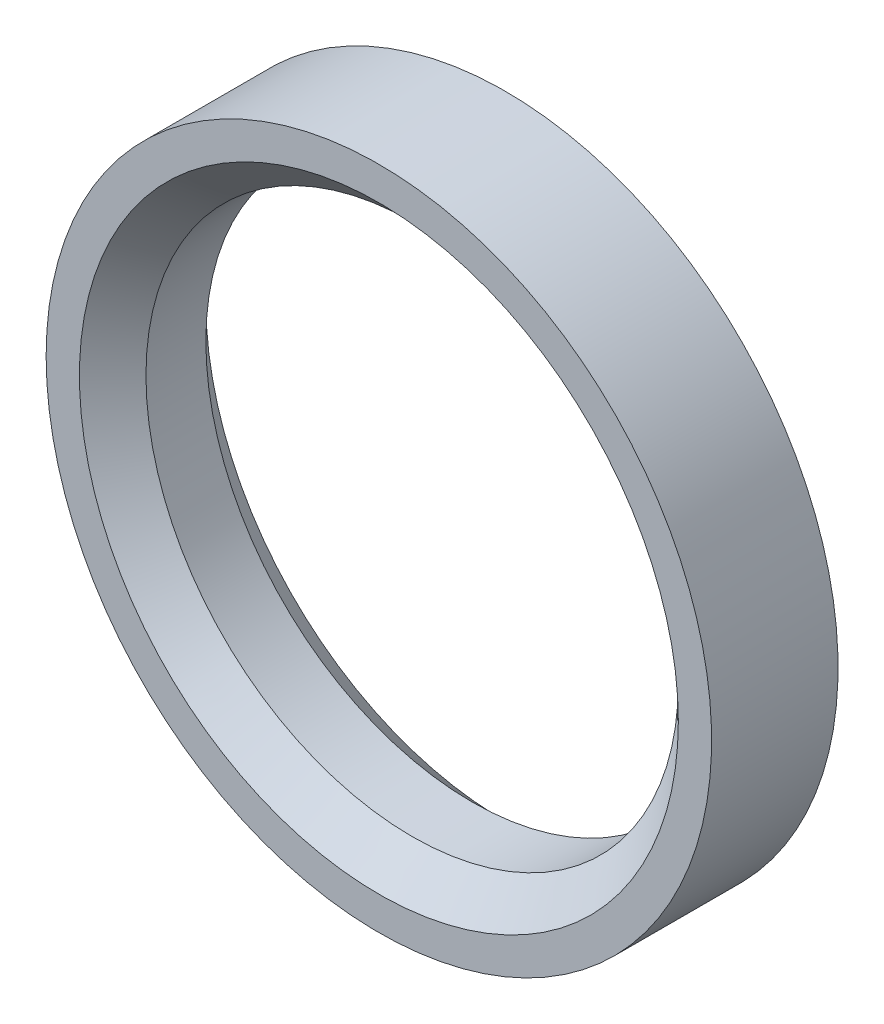
ISO-10303-21;
HEADER;
FILE_DESCRIPTION(('STEP AP214'),'2;1');
FILE_NAME('part.step','',(''),(''),'','','');
FILE_SCHEMA(('AUTOMOTIVE_DESIGN { 1 0 10303 214 1 1 1 1 }'));
ENDSEC;
DATA;
#1=APPLICATION_CONTEXT('core data for automotive mechanical design processes');
#2=APPLICATION_PROTOCOL_DEFINITION('international standard','automotive_design',2000,#1);
#3=PRODUCT_CONTEXT('',#1,'mechanical');
#4=PRODUCT('Part','Part','',(#3));
#5=PRODUCT_RELATED_PRODUCT_CATEGORY('part','',(#4));
#6=PRODUCT_DEFINITION_FORMATION('','',#4);
#7=PRODUCT_DEFINITION_CONTEXT('part definition',#1,'design');
#8=PRODUCT_DEFINITION('design','',#6,#7);
#9=PRODUCT_DEFINITION_SHAPE('','',#8);
#10=(LENGTH_UNIT() NAMED_UNIT(*) SI_UNIT(.MILLI.,.METRE.));
#11=(NAMED_UNIT(*) PLANE_ANGLE_UNIT() SI_UNIT($,.RADIAN.));
#12=(NAMED_UNIT(*) SI_UNIT($,.STERADIAN.) SOLID_ANGLE_UNIT());
#13=UNCERTAINTY_MEASURE_WITH_UNIT(LENGTH_MEASURE(1.E-05),#10,'distance_accuracy_value','');
#14=(GEOMETRIC_REPRESENTATION_CONTEXT(3) GLOBAL_UNCERTAINTY_ASSIGNED_CONTEXT((#13)) GLOBAL_UNIT_ASSIGNED_CONTEXT((#10,
#11,#12)) REPRESENTATION_CONTEXT('',''));
#15=CARTESIAN_POINT('',(0.,0.,0.));
#16=DIRECTION('',(0.,0.,1.));
#17=DIRECTION('',(1.,0.,0.));
#18=AXIS2_PLACEMENT_3D('',#15,#16,#17);
#19=CARTESIAN_POINT('',(0.,0.,1.9));
#20=DIRECTION('',(0.,0.,1.));
#21=DIRECTION('',(1.,0.,0.));
#22=AXIS2_PLACEMENT_3D('',#19,#20,#21);
#23=PLANE('',#22);
#24=CARTESIAN_POINT('',(0.,0.,1.9));
#25=DIRECTION('',(0.,0.,1.));
#26=DIRECTION('',(1.,0.,0.));
#27=AXIS2_PLACEMENT_3D('',#24,#25,#26);
#28=CIRCLE('',#27,4.50000000000001);
#29=CARTESIAN_POINT('',(4.50000000000001,0.,1.9));
#30=VERTEX_POINT('',#29);
#31=EDGE_CURVE('E10',#30,#30,#28,.F.);
#32=ORIENTED_EDGE('',*,*,#31,.T.);
#33=EDGE_LOOP('',(#32));
#34=FACE_BOUND('',#33,.T.);
#35=CARTESIAN_POINT('',(0.,0.,1.9));
#36=DIRECTION('',(0.,0.,1.));
#37=DIRECTION('',(1.,0.,0.));
#38=AXIS2_PLACEMENT_3D('',#35,#36,#37);
#39=CIRCLE('',#38,5.);
#40=CARTESIAN_POINT('',(-5.,0.,1.9));
#41=VERTEX_POINT('',#40);
#42=EDGE_CURVE('E53',#41,#41,#39,.T.);
#43=ORIENTED_EDGE('',*,*,#42,.T.);
#44=EDGE_LOOP('',(#43));
#45=FACE_BOUND('',#44,.T.);
#46=ADVANCED_FACE('F33',(#34,#45),#23,.T.);
#47=CARTESIAN_POINT('',(0.,0.,0.));
#48=DIRECTION('',(0.,0.,1.));
#49=DIRECTION('',(1.,0.,0.));
#50=AXIS2_PLACEMENT_3D('',#47,#48,#49);
#51=PLANE('',#50);
#52=CARTESIAN_POINT('',(0.,0.,0.));
#53=DIRECTION('',(0.,0.,1.));
#54=DIRECTION('',(1.,0.,0.));
#55=AXIS2_PLACEMENT_3D('',#52,#53,#54);
#56=CIRCLE('',#55,4.5);
#57=CARTESIAN_POINT('',(4.5,0.,0.));
#58=VERTEX_POINT('',#57);
#59=EDGE_CURVE('E48',#58,#58,#56,.T.);
#60=ORIENTED_EDGE('',*,*,#59,.T.);
#61=EDGE_LOOP('',(#60));
#62=FACE_BOUND('',#61,.T.);
#63=CARTESIAN_POINT('',(0.,0.,0.));
#64=DIRECTION('',(0.,0.,1.));
#65=DIRECTION('',(1.,0.,0.));
#66=AXIS2_PLACEMENT_3D('',#63,#64,#65);
#67=CIRCLE('',#66,5.);
#68=CARTESIAN_POINT('',(-5.,0.,0.));
#69=VERTEX_POINT('',#68);
#70=EDGE_CURVE('E54',#69,#69,#67,.T.);
#71=ORIENTED_EDGE('',*,*,#70,.F.);
#72=EDGE_LOOP('',(#71));
#73=FACE_BOUND('',#72,.T.);
#74=ADVANCED_FACE('F65',(#62,#73),#51,.F.);
#75=CARTESIAN_POINT('',(0.,0.,1.9));
#76=DIRECTION('',(0.,0.,-1.));
#77=DIRECTION('',(-1.,0.,0.));
#78=AXIS2_PLACEMENT_3D('',#75,#76,#77);
#79=CYLINDRICAL_SURFACE('',#78,5.);
#80=CARTESIAN_POINT('',(-5.,0.,1.9));
#81=CARTESIAN_POINT('',(-5.,0.,1.88020833333333));
#82=CARTESIAN_POINT('',(-5.,0.,1.86041666666667));
#83=CARTESIAN_POINT('',(-5.,0.,1.82083333333333));
#84=CARTESIAN_POINT('',(-5.,0.,1.80104166666667));
#85=CARTESIAN_POINT('',(-5.,0.,1.76145833333333));
#86=CARTESIAN_POINT('',(-5.,0.,1.74166666666667));
#87=CARTESIAN_POINT('',(-5.,0.,1.70208333333333));
#88=CARTESIAN_POINT('',(-5.,0.,1.68229166666667));
#89=CARTESIAN_POINT('',(-5.,0.,1.64270833333333));
#90=CARTESIAN_POINT('',(-5.,0.,1.62291666666667));
#91=CARTESIAN_POINT('',(-5.,0.,1.58333333333333));
#92=CARTESIAN_POINT('',(-5.,0.,1.56354166666667));
#93=CARTESIAN_POINT('',(-5.,0.,1.52395833333333));
#94=CARTESIAN_POINT('',(-5.,0.,1.50416666666667));
#95=CARTESIAN_POINT('',(-5.,0.,1.46458333333333));
#96=CARTESIAN_POINT('',(-5.,0.,1.44479166666667));
#97=CARTESIAN_POINT('',(-5.,0.,1.40520833333333));
#98=CARTESIAN_POINT('',(-5.,0.,1.38541666666667));
#99=CARTESIAN_POINT('',(-5.,0.,1.34583333333333));
#100=CARTESIAN_POINT('',(-5.,0.,1.32604166666667));
#101=CARTESIAN_POINT('',(-5.,0.,1.28645833333333));
#102=CARTESIAN_POINT('',(-5.,0.,1.26666666666667));
#103=CARTESIAN_POINT('',(-5.,0.,1.22708333333333));
#104=CARTESIAN_POINT('',(-5.,0.,1.20729166666667));
#105=CARTESIAN_POINT('',(-5.,0.,1.16770833333333));
#106=CARTESIAN_POINT('',(-5.,0.,1.14791666666667));
#107=CARTESIAN_POINT('',(-5.,0.,1.10833333333333));
#108=CARTESIAN_POINT('',(-5.,0.,1.08854166666667));
#109=CARTESIAN_POINT('',(-5.,0.,1.04895833333333));
#110=CARTESIAN_POINT('',(-5.,0.,1.02916666666667));
#111=CARTESIAN_POINT('',(-5.,0.,0.989583333333333));
#112=CARTESIAN_POINT('',(-5.,0.,0.969791666666666));
#113=CARTESIAN_POINT('',(-5.,0.,0.930208333333333));
#114=CARTESIAN_POINT('',(-5.,0.,0.910416666666666));
#115=CARTESIAN_POINT('',(-5.,0.,0.870833333333333));
#116=CARTESIAN_POINT('',(-5.,0.,0.851041666666666));
#117=CARTESIAN_POINT('',(-5.,0.,0.811458333333333));
#118=CARTESIAN_POINT('',(-5.,0.,0.791666666666666));
#119=CARTESIAN_POINT('',(-5.,0.,0.752083333333333));
#120=CARTESIAN_POINT('',(-5.,0.,0.732291666666666));
#121=CARTESIAN_POINT('',(-5.,0.,0.692708333333333));
#122=CARTESIAN_POINT('',(-5.,0.,0.672916666666666));
#123=CARTESIAN_POINT('',(-5.,0.,0.633333333333333));
#124=CARTESIAN_POINT('',(-5.,0.,0.613541666666666));
#125=CARTESIAN_POINT('',(-5.,0.,0.573958333333333));
#126=CARTESIAN_POINT('',(-5.,0.,0.554166666666666));
#127=CARTESIAN_POINT('',(-5.,0.,0.514583333333333));
#128=CARTESIAN_POINT('',(-5.,0.,0.494791666666666));
#129=CARTESIAN_POINT('',(-5.,0.,0.455208333333333));
#130=CARTESIAN_POINT('',(-5.,0.,0.435416666666666));
#131=CARTESIAN_POINT('',(-5.,0.,0.395833333333333));
#132=CARTESIAN_POINT('',(-5.,0.,0.376041666666666));
#133=CARTESIAN_POINT('',(-5.,0.,0.336458333333333));
#134=CARTESIAN_POINT('',(-5.,0.,0.316666666666666));
#135=CARTESIAN_POINT('',(-5.,0.,0.277083333333333));
#136=CARTESIAN_POINT('',(-5.,0.,0.257291666666666));
#137=CARTESIAN_POINT('',(-5.,0.,0.217708333333333));
#138=CARTESIAN_POINT('',(-5.,0.,0.197916666666666));
#139=CARTESIAN_POINT('',(-5.,0.,0.158333333333333));
#140=CARTESIAN_POINT('',(-5.,0.,0.138541666666666));
#141=CARTESIAN_POINT('',(-5.,0.,0.0989583333333331));
#142=CARTESIAN_POINT('',(-5.,0.,0.0791666666666664));
#143=CARTESIAN_POINT('',(-5.,0.,0.0395833333333331));
#144=CARTESIAN_POINT('',(-5.,0.,0.0197916666666664));
#145=CARTESIAN_POINT('',(-5.,0.,0.));
#146=B_SPLINE_CURVE_WITH_KNOTS('',3,(#80,#81,#82,#83,#84,#85,#86,#87,#88,#89,#90,#91,#92,#93,
#94,#95,#96,#97,#98,#99,#100,#101,#102,#103,#104,#105,#106,#107,#108,#109,#110,#111,#112,#113,
#114,#115,#116,#117,#118,#119,#120,#121,#122,#123,#124,#125,#126,#127,#128,#129,#130,#131,#132,
#133,#134,#135,#136,#137,#138,#139,#140,#141,#142,#143,#144,#145),.UNSPECIFIED.,.F.,.F.,(4,2,2,
2,2,2,2,2,2,2,2,2,2,2,2,2,2,2,2,2,2,2,2,2,2,2,2,2,2,2,2,2,4),(0.,0.0593749999999997,0.11875,
0.178125,0.2375,0.296875,0.35625,0.415625,0.475,0.534374999999999,0.593749999999999,
0.653124999999999,0.712499999999999,0.771874999999999,0.831249999999999,0.890624999999999,
0.949999999999999,1.009375,1.06875,1.128125,1.1875,1.246875,1.30625,1.365625,1.425,1.484375,
1.54375,1.603125,1.6625,1.721875,1.78125,1.840625,1.9),.UNSPECIFIED.);
#147=EDGE_CURVE('BSEAM61',#41,#69,#146,.T.);
#148=ORIENTED_EDGE('',*,*,#42,.F.);
#149=ORIENTED_EDGE('',*,*,#70,.T.);
#150=ORIENTED_EDGE('',*,*,#147,.T.);
#151=ORIENTED_EDGE('',*,*,#147,.F.);
#152=EDGE_LOOP('',(#148,#150,#149,#151));
#153=FACE_BOUND('',#152,.T.);
#154=ADVANCED_FACE('F61',(#153),#79,.T.);
#155=CARTESIAN_POINT('',(0.,0.,1.9));
#156=DIRECTION('',(0.,0.,-1.));
#157=DIRECTION('',(-1.,0.,0.));
#158=AXIS2_PLACEMENT_3D('',#155,#156,#157);
#159=CYLINDRICAL_SURFACE('',#158,4.);
#160=CARTESIAN_POINT('',(0.,0.,0.5));
#161=DIRECTION('',(0.,0.,1.));
#162=DIRECTION('',(1.,0.,0.));
#163=AXIS2_PLACEMENT_3D('',#160,#161,#162);
#164=CIRCLE('',#163,4.);
#165=CARTESIAN_POINT('',(-4.,0.,0.5));
#166=VERTEX_POINT('',#165);
#167=EDGE_CURVE('E40',#166,#166,#164,.F.);
#168=CARTESIAN_POINT('',(0.,0.,1.39999999999999));
#169=DIRECTION('',(0.,0.,1.));
#170=DIRECTION('',(1.,0.,0.));
#171=AXIS2_PLACEMENT_3D('',#168,#169,#170);
#172=CIRCLE('',#171,4.);
#173=CARTESIAN_POINT('',(-4.,0.,1.39999999999999));
#174=VERTEX_POINT('',#173);
#175=EDGE_CURVE('E44',#174,#174,#172,.T.);
#176=CARTESIAN_POINT('',(-4.,0.,0.5));
#177=CARTESIAN_POINT('',(-4.,0.,0.509375));
#178=CARTESIAN_POINT('',(-4.,0.,0.51875));
#179=CARTESIAN_POINT('',(-4.,0.,0.5375));
#180=CARTESIAN_POINT('',(-4.,0.,0.546875));
#181=CARTESIAN_POINT('',(-4.,0.,0.565625));
#182=CARTESIAN_POINT('',(-4.,0.,0.574999999999999));
#183=CARTESIAN_POINT('',(-4.,0.,0.593749999999999));
#184=CARTESIAN_POINT('',(-4.,0.,0.603124999999999));
#185=CARTESIAN_POINT('',(-4.,0.,0.621874999999999));
#186=CARTESIAN_POINT('',(-4.,0.,0.631249999999999));
#187=CARTESIAN_POINT('',(-4.,0.,0.649999999999999));
#188=CARTESIAN_POINT('',(-4.,0.,0.659374999999999));
#189=CARTESIAN_POINT('',(-4.,0.,0.678124999999999));
#190=CARTESIAN_POINT('',(-4.,0.,0.687499999999998));
#191=CARTESIAN_POINT('',(-4.,0.,0.706249999999998));
#192=CARTESIAN_POINT('',(-4.,0.,0.715624999999998));
#193=CARTESIAN_POINT('',(-4.,0.,0.734374999999998));
#194=CARTESIAN_POINT('',(-4.,0.,0.743749999999998));
#195=CARTESIAN_POINT('',(-4.,0.,0.762499999999998));
#196=CARTESIAN_POINT('',(-4.,0.,0.771874999999998));
#197=CARTESIAN_POINT('',(-4.,0.,0.790624999999997));
#198=CARTESIAN_POINT('',(-4.,0.,0.799999999999997));
#199=CARTESIAN_POINT('',(-4.,0.,0.818749999999997));
#200=CARTESIAN_POINT('',(-4.,0.,0.828124999999997));
#201=CARTESIAN_POINT('',(-4.,0.,0.846874999999997));
#202=CARTESIAN_POINT('',(-4.,0.,0.856249999999997));
#203=CARTESIAN_POINT('',(-4.,0.,0.874999999999997));
#204=CARTESIAN_POINT('',(-4.,0.,0.884374999999996));
#205=CARTESIAN_POINT('',(-4.,0.,0.903124999999996));
#206=CARTESIAN_POINT('',(-4.,0.,0.912499999999996));
#207=CARTESIAN_POINT('',(-4.,0.,0.931249999999996));
#208=CARTESIAN_POINT('',(-4.,0.,0.940624999999996));
#209=CARTESIAN_POINT('',(-4.,0.,0.959374999999996));
#210=CARTESIAN_POINT('',(-4.,0.,0.968749999999996));
#211=CARTESIAN_POINT('',(-4.,0.,0.987499999999995));
#212=CARTESIAN_POINT('',(-4.,0.,0.996874999999995));
#213=CARTESIAN_POINT('',(-4.,0.,1.015625));
#214=CARTESIAN_POINT('',(-4.,0.,1.025));
#215=CARTESIAN_POINT('',(-4.,0.,1.04374999999999));
#216=CARTESIAN_POINT('',(-4.,0.,1.05312499999999));
#217=CARTESIAN_POINT('',(-4.,0.,1.07187499999999));
#218=CARTESIAN_POINT('',(-4.,0.,1.08124999999999));
#219=CARTESIAN_POINT('',(-4.,0.,1.09999999999999));
#220=CARTESIAN_POINT('',(-4.,0.,1.10937499999999));
#221=CARTESIAN_POINT('',(-4.,0.,1.12812499999999));
#222=CARTESIAN_POINT('',(-4.,0.,1.13749999999999));
#223=CARTESIAN_POINT('',(-4.,0.,1.15624999999999));
#224=CARTESIAN_POINT('',(-4.,0.,1.16562499999999));
#225=CARTESIAN_POINT('',(-4.,0.,1.18437499999999));
#226=CARTESIAN_POINT('',(-4.,0.,1.19374999999999));
#227=CARTESIAN_POINT('',(-4.,0.,1.21249999999999));
#228=CARTESIAN_POINT('',(-4.,0.,1.22187499999999));
#229=CARTESIAN_POINT('',(-4.,0.,1.24062499999999));
#230=CARTESIAN_POINT('',(-4.,0.,1.24999999999999));
#231=CARTESIAN_POINT('',(-4.,0.,1.26874999999999));
#232=CARTESIAN_POINT('',(-4.,0.,1.27812499999999));
#233=CARTESIAN_POINT('',(-4.,0.,1.29687499999999));
#234=CARTESIAN_POINT('',(-4.,0.,1.30624999999999));
#235=CARTESIAN_POINT('',(-4.,0.,1.32499999999999));
#236=CARTESIAN_POINT('',(-4.,0.,1.33437499999999));
#237=CARTESIAN_POINT('',(-4.,0.,1.35312499999999));
#238=CARTESIAN_POINT('',(-4.,0.,1.36249999999999));
#239=CARTESIAN_POINT('',(-4.,0.,1.38124999999999));
#240=CARTESIAN_POINT('',(-4.,0.,1.39062499999999));
#241=CARTESIAN_POINT('',(-4.,0.,1.39999999999999));
#242=B_SPLINE_CURVE_WITH_KNOTS('',3,(#176,#177,#178,#179,#180,#181,#182,#183,#184,#185,#186,
#187,#188,#189,#190,#191,#192,#193,#194,#195,#196,#197,#198,#199,#200,#201,#202,#203,#204,#205,
#206,#207,#208,#209,#210,#211,#212,#213,#214,#215,#216,#217,#218,#219,#220,#221,#222,#223,#224,
#225,#226,#227,#228,#229,#230,#231,#232,#233,#234,#235,#236,#237,#238,#239,#240,#241),
.UNSPECIFIED.,.F.,.F.,(4,2,2,2,2,2,2,2,2,2,2,2,2,2,2,2,2,2,2,2,2,2,2,2,2,2,2,2,2,2,2,2,4),(0.,
0.0281249999999997,0.0562499999999994,0.0843749999999992,0.112499999999999,0.140624999999999,
0.168749999999998,0.196874999999998,0.224999999999998,0.253124999999997,0.281249999999997,
0.309374999999997,0.337499999999997,0.365624999999997,0.393749999999996,0.421874999999996,
0.449999999999996,0.478124999999995,0.506249999999995,0.534374999999995,0.562499999999994,
0.590624999999994,0.618749999999994,0.646874999999994,0.674999999999993,0.703124999999993,
0.731249999999993,0.759374999999992,0.787499999999992,0.815624999999992,0.843749999999992,
0.871874999999991,0.899999999999991),.UNSPECIFIED.);
#243=EDGE_CURVE('BSEAM64',#166,#174,#242,.T.);
#244=ORIENTED_EDGE('',*,*,#167,.T.);
#245=ORIENTED_EDGE('',*,*,#175,.T.);
#246=ORIENTED_EDGE('',*,*,#243,.T.);
#247=ORIENTED_EDGE('',*,*,#243,.F.);
#248=EDGE_LOOP('',(#244,#246,#245,#247));
#249=FACE_BOUND('',#248,.T.);
#250=ADVANCED_FACE('F64',(#249),#159,.F.);
#251=CARTESIAN_POINT('',(0.,0.,0.));
#252=DIRECTION('',(0.,0.,-1.));
#253=DIRECTION('',(-1.,0.,0.));
#254=AXIS2_PLACEMENT_3D('',#251,#252,#253);
#255=CONICAL_SURFACE('',#254,4.5,0.785398163397447);
#256=ORIENTED_EDGE('',*,*,#167,.F.);
#257=EDGE_LOOP('',(#256));
#258=FACE_BOUND('',#257,.T.);
#259=ORIENTED_EDGE('',*,*,#59,.F.);
#260=EDGE_LOOP('',(#259));
#261=FACE_BOUND('',#260,.T.);
#262=ADVANCED_FACE('F77',(#258,#261),#255,.F.);
#263=CARTESIAN_POINT('',(0.,0.,1.39999999999999));
#264=DIRECTION('',(0.,0.,1.));
#265=DIRECTION('',(1.,0.,0.));
#266=AXIS2_PLACEMENT_3D('',#263,#264,#265);
#267=CONICAL_SURFACE('',#266,4.,0.785398163397449);
#268=ORIENTED_EDGE('',*,*,#31,.F.);
#269=EDGE_LOOP('',(#268));
#270=FACE_BOUND('',#269,.T.);
#271=ORIENTED_EDGE('',*,*,#175,.F.);
#272=EDGE_LOOP('',(#271));
#273=FACE_BOUND('',#272,.T.);
#274=ADVANCED_FACE('F35',(#270,#273),#267,.F.);
#275=CLOSED_SHELL('',(#46,#74,#154,#250,#262,#274));
#276=MANIFOLD_SOLID_BREP('B2',#275);
#277=ADVANCED_BREP_SHAPE_REPRESENTATION('',(#18,#276),#14);
#278=SHAPE_DEFINITION_REPRESENTATION(#9,#277);
ENDSEC;
END-ISO-10303-21;
